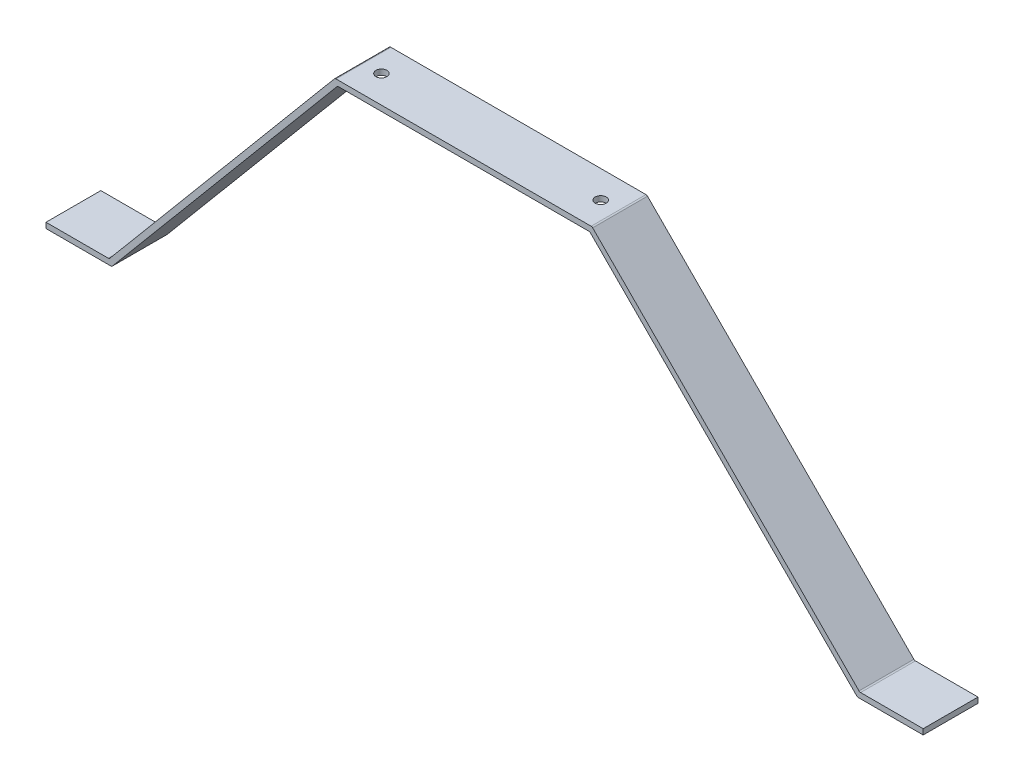
ISO-10303-21;
HEADER;
FILE_DESCRIPTION(('STEP AP214'),'2;1');
FILE_NAME('part.step','',(''),(''),'','','');
FILE_SCHEMA(('AUTOMOTIVE_DESIGN { 1 0 10303 214 1 1 1 1 }'));
ENDSEC;
DATA;
#1=APPLICATION_CONTEXT('core data for automotive mechanical design processes');
#2=APPLICATION_PROTOCOL_DEFINITION('international standard','automotive_design',2000,#1);
#3=PRODUCT_CONTEXT('',#1,'mechanical');
#4=PRODUCT('Part','Part','',(#3));
#5=PRODUCT_RELATED_PRODUCT_CATEGORY('part','',(#4));
#6=PRODUCT_DEFINITION_FORMATION('','',#4);
#7=PRODUCT_DEFINITION_CONTEXT('part definition',#1,'design');
#8=PRODUCT_DEFINITION('design','',#6,#7);
#9=PRODUCT_DEFINITION_SHAPE('','',#8);
#10=(LENGTH_UNIT() NAMED_UNIT(*) SI_UNIT(.MILLI.,.METRE.));
#11=(NAMED_UNIT(*) PLANE_ANGLE_UNIT() SI_UNIT($,.RADIAN.));
#12=(NAMED_UNIT(*) SI_UNIT($,.STERADIAN.) SOLID_ANGLE_UNIT());
#13=UNCERTAINTY_MEASURE_WITH_UNIT(LENGTH_MEASURE(1.E-05),#10,'distance_accuracy_value','');
#14=(GEOMETRIC_REPRESENTATION_CONTEXT(3) GLOBAL_UNCERTAINTY_ASSIGNED_CONTEXT((#13)) GLOBAL_UNIT_ASSIGNED_CONTEXT((#10,
#11,#12)) REPRESENTATION_CONTEXT('',''));
#15=CARTESIAN_POINT('',(0.,0.,0.));
#16=DIRECTION('',(0.,0.,1.));
#17=DIRECTION('',(1.,0.,0.));
#18=AXIS2_PLACEMENT_3D('',#15,#16,#17);
#19=CARTESIAN_POINT('',(0.,5.,50.));
#20=DIRECTION('',(1.,0.,0.));
#21=DIRECTION('',(0.,0.,-1.));
#22=AXIS2_PLACEMENT_3D('',#19,#20,#21);
#23=PLANE('',#22);
#24=DIRECTION('',(0.,-1.,0.));
#25=VECTOR('',#24,1.);
#26=CARTESIAN_POINT('',(0.,5.,0.));
#27=LINE('',#26,#25);
#28=CARTESIAN_POINT('',(0.,5.,0.));
#29=VERTEX_POINT('',#28);
#30=CARTESIAN_POINT('',(0.,0.,0.));
#31=VERTEX_POINT('',#30);
#32=EDGE_CURVE('E193',#29,#31,#27,.T.);
#33=ORIENTED_EDGE('',*,*,#32,.T.);
#34=DIRECTION('',(0.,0.,-1.));
#35=VECTOR('',#34,1.);
#36=CARTESIAN_POINT('',(0.,0.,50.));
#37=LINE('',#36,#35);
#38=CARTESIAN_POINT('',(0.,0.,50.));
#39=VERTEX_POINT('',#38);
#40=EDGE_CURVE('E175',#39,#31,#37,.T.);
#41=ORIENTED_EDGE('',*,*,#40,.F.);
#42=DIRECTION('',(0.,-1.,0.));
#43=VECTOR('',#42,1.);
#44=CARTESIAN_POINT('',(0.,5.,50.));
#45=LINE('',#44,#43);
#46=CARTESIAN_POINT('',(0.,5.,50.));
#47=VERTEX_POINT('',#46);
#48=EDGE_CURVE('E181',#47,#39,#45,.T.);
#49=ORIENTED_EDGE('',*,*,#48,.F.);
#50=DIRECTION('',(0.,0.,-1.));
#51=VECTOR('',#50,1.);
#52=CARTESIAN_POINT('',(0.,5.,50.));
#53=LINE('',#52,#51);
#54=EDGE_CURVE('E305',#47,#29,#53,.T.);
#55=ORIENTED_EDGE('',*,*,#54,.T.);
#56=EDGE_LOOP('',(#33,#41,#49,#55));
#57=FACE_BOUND('',#56,.T.);
#58=ADVANCED_FACE('F32',(#57),#23,.F.);
#59=CARTESIAN_POINT('',(0.,0.,50.));
#60=DIRECTION('',(0.,1.,0.));
#61=DIRECTION('',(0.,0.,1.));
#62=AXIS2_PLACEMENT_3D('',#59,#60,#61);
#63=PLANE('',#62);
#64=DIRECTION('',(1.,0.,0.));
#65=VECTOR('',#64,1.);
#66=CARTESIAN_POINT('',(0.,0.,0.));
#67=LINE('',#66,#65);
#68=CARTESIAN_POINT('',(59.0672769655389,0.,0.));
#69=VERTEX_POINT('',#68);
#70=EDGE_CURVE('E307',#31,#69,#67,.T.);
#71=ORIENTED_EDGE('',*,*,#70,.T.);
#72=DIRECTION('',(0.,0.,-1.));
#73=VECTOR('',#72,1.);
#74=CARTESIAN_POINT('',(59.0672769655389,0.,50.));
#75=LINE('',#74,#73);
#76=CARTESIAN_POINT('',(59.0672769655389,0.,50.));
#77=VERTEX_POINT('',#76);
#78=EDGE_CURVE('E178',#69,#77,#75,.F.);
#79=ORIENTED_EDGE('',*,*,#78,.T.);
#80=DIRECTION('',(1.,0.,0.));
#81=VECTOR('',#80,1.);
#82=CARTESIAN_POINT('',(0.,0.,50.));
#83=LINE('',#82,#81);
#84=EDGE_CURVE('E170',#39,#77,#83,.T.);
#85=ORIENTED_EDGE('',*,*,#84,.F.);
#86=ORIENTED_EDGE('',*,*,#40,.T.);
#87=EDGE_LOOP('',(#71,#79,#85,#86));
#88=FACE_BOUND('',#87,.T.);
#89=ADVANCED_FACE('F173',(#88),#63,.F.);
#90=CARTESIAN_POINT('',(265.92,245.45,50.));
#91=DIRECTION('',(-0.766101312166316,0.642719829705797,0.));
#92=DIRECTION('',(-0.642719829705797,-0.766101312166316,0.));
#93=AXIS2_PLACEMENT_3D('',#90,#91,#92);
#94=PLANE('',#93);
#95=DIRECTION('',(0.642719829705797,0.766101312166316,0.));
#96=VECTOR('',#95,1.);
#97=CARTESIAN_POINT('',(265.92,245.45,50.));
#98=LINE('',#97,#96);
#99=CARTESIAN_POINT('',(60.5994795898716,0.714560340588505,50.));
#100=VERTEX_POINT('',#99);
#101=CARTESIAN_POINT('',(265.320520410128,244.735439659412,50.));
#102=VERTEX_POINT('',#101);
#103=EDGE_CURVE('E180',#100,#102,#98,.T.);
#104=ORIENTED_EDGE('',*,*,#103,.F.);
#105=DIRECTION('',(0.,0.,-1.));
#106=VECTOR('',#105,1.);
#107=CARTESIAN_POINT('',(60.5994795898715,0.714560340588394,50.));
#108=LINE('',#107,#106);
#109=CARTESIAN_POINT('',(60.5994795898716,0.714560340588505,0.));
#110=VERTEX_POINT('',#109);
#111=EDGE_CURVE('E211',#100,#110,#108,.T.);
#112=ORIENTED_EDGE('',*,*,#111,.T.);
#113=DIRECTION('',(0.642719829705797,0.766101312166316,0.));
#114=VECTOR('',#113,1.);
#115=CARTESIAN_POINT('',(265.92,245.45,0.));
#116=LINE('',#115,#114);
#117=CARTESIAN_POINT('',(265.320520410128,244.735439659412,0.));
#118=VERTEX_POINT('',#117);
#119=EDGE_CURVE('E310',#110,#118,#116,.T.);
#120=ORIENTED_EDGE('',*,*,#119,.T.);
#121=DIRECTION('',(0.,0.,-1.));
#122=VECTOR('',#121,1.);
#123=CARTESIAN_POINT('',(265.320520410128,244.735439659412,50.));
#124=LINE('',#123,#122);
#125=EDGE_CURVE('E209',#118,#102,#124,.F.);
#126=ORIENTED_EDGE('',*,*,#125,.T.);
#127=EDGE_LOOP('',(#104,#112,#120,#126));
#128=FACE_BOUND('',#127,.T.);
#129=ADVANCED_FACE('F338',(#128),#94,.F.);
#130=CARTESIAN_POINT('',(265.92,245.45,50.));
#131=DIRECTION('',(0.,1.,0.));
#132=DIRECTION('',(0.,0.,1.));
#133=AXIS2_PLACEMENT_3D('',#130,#131,#132);
#134=PLANE('',#133);
#135=CARTESIAN_POINT('',(280.919525398347,245.45,24.9999998959961));
#136=DIRECTION('',(0.,1.,0.));
#137=DIRECTION('',(0.,0.,1.));
#138=AXIS2_PLACEMENT_3D('',#135,#136,#137);
#139=CIRCLE('',#138,4.99999999999999);
#140=CARTESIAN_POINT('',(280.919525398347,245.45,29.9999998959961));
#141=VERTEX_POINT('',#140);
#142=EDGE_CURVE('E569',#141,#141,#139,.F.);
#143=ORIENTED_EDGE('',*,*,#142,.F.);
#144=EDGE_LOOP('',(#143));
#145=FACE_BOUND('',#144,.T.);
#146=CARTESIAN_POINT('',(480.919525398347,245.45,24.9999998959962));
#147=DIRECTION('',(0.,1.,0.));
#148=DIRECTION('',(0.,0.,1.));
#149=AXIS2_PLACEMENT_3D('',#146,#147,#148);
#150=CIRCLE('',#149,4.99999999999999);
#151=CARTESIAN_POINT('',(480.919525398347,245.45,29.9999998959962));
#152=VERTEX_POINT('',#151);
#153=EDGE_CURVE('E308',#152,#152,#150,.F.);
#154=ORIENTED_EDGE('',*,*,#153,.F.);
#155=EDGE_LOOP('',(#154));
#156=FACE_BOUND('',#155,.T.);
#157=DIRECTION('',(1.,0.,0.));
#158=VECTOR('',#157,1.);
#159=CARTESIAN_POINT('',(265.92,245.45,50.));
#160=LINE('',#159,#158);
#161=CARTESIAN_POINT('',(266.852723034461,245.45,50.));
#162=VERTEX_POINT('',#161);
#163=CARTESIAN_POINT('',(495.088292213114,245.45,50.));
#164=VERTEX_POINT('',#163);
#165=EDGE_CURVE('E340',#162,#164,#160,.T.);
#166=ORIENTED_EDGE('',*,*,#165,.F.);
#167=DIRECTION('',(0.,0.,-1.));
#168=VECTOR('',#167,1.);
#169=CARTESIAN_POINT('',(266.852723034461,245.45,0.));
#170=LINE('',#169,#168);
#171=CARTESIAN_POINT('',(266.852723034461,245.45,0.));
#172=VERTEX_POINT('',#171);
#173=EDGE_CURVE('E232',#162,#172,#170,.T.);
#174=ORIENTED_EDGE('',*,*,#173,.T.);
#175=DIRECTION('',(1.,0.,0.));
#176=VECTOR('',#175,1.);
#177=CARTESIAN_POINT('',(265.92,245.45,0.));
#178=LINE('',#177,#176);
#179=CARTESIAN_POINT('',(495.088292213114,245.45,0.));
#180=VERTEX_POINT('',#179);
#181=EDGE_CURVE('E313',#172,#180,#178,.T.);
#182=ORIENTED_EDGE('',*,*,#181,.T.);
#183=DIRECTION('',(0.,0.,-1.));
#184=VECTOR('',#183,1.);
#185=CARTESIAN_POINT('',(495.088292213114,245.45,50.));
#186=LINE('',#185,#184);
#187=EDGE_CURVE('E230',#180,#164,#186,.F.);
#188=ORIENTED_EDGE('',*,*,#187,.T.);
#189=EDGE_LOOP('',(#166,#174,#182,#188));
#190=FACE_BOUND('',#189,.T.);
#191=ADVANCED_FACE('F374',(#145,#156,#190),#134,.F.);
#192=CARTESIAN_POINT('',(495.92,245.45,50.));
#193=DIRECTION('',(0.709082915336722,0.705125108883222,0.));
#194=DIRECTION('',(-0.705125108883222,0.709082915336722,0.));
#195=AXIS2_PLACEMENT_3D('',#192,#193,#194);
#196=PLANE('',#195);
#197=DIRECTION('',(0.705125108883222,-0.709082915336721,0.));
#198=VECTOR('',#197,1.);
#199=CARTESIAN_POINT('',(495.92,245.45,50.));
#200=LINE('',#199,#198);
#201=CARTESIAN_POINT('',(496.506458043787,244.860250217766,50.));
#202=VERTEX_POINT('',#201);
#203=CARTESIAN_POINT('',(739.413541956213,0.589749782233501,50.));
#204=VERTEX_POINT('',#203);
#205=EDGE_CURVE('E343',#202,#204,#200,.T.);
#206=ORIENTED_EDGE('',*,*,#205,.F.);
#207=DIRECTION('',(0.,0.,-1.));
#208=VECTOR('',#207,1.);
#209=CARTESIAN_POINT('',(496.506458043787,244.860250217766,0.));
#210=LINE('',#209,#208);
#211=CARTESIAN_POINT('',(496.506458043787,244.860250217766,0.));
#212=VERTEX_POINT('',#211);
#213=EDGE_CURVE('E241',#202,#212,#210,.T.);
#214=ORIENTED_EDGE('',*,*,#213,.T.);
#215=DIRECTION('',(0.705125108883222,-0.709082915336721,0.));
#216=VECTOR('',#215,1.);
#217=CARTESIAN_POINT('',(495.92,245.45,0.));
#218=LINE('',#217,#216);
#219=CARTESIAN_POINT('',(739.413541956213,0.589749782233501,0.));
#220=VERTEX_POINT('',#219);
#221=EDGE_CURVE('E316',#212,#220,#218,.T.);
#222=ORIENTED_EDGE('',*,*,#221,.T.);
#223=DIRECTION('',(0.,0.,-1.));
#224=VECTOR('',#223,1.);
#225=CARTESIAN_POINT('',(739.413541956213,0.589749782233501,50.));
#226=LINE('',#225,#224);
#227=EDGE_CURVE('E239',#220,#204,#226,.F.);
#228=ORIENTED_EDGE('',*,*,#227,.T.);
#229=EDGE_LOOP('',(#206,#214,#222,#228));
#230=FACE_BOUND('',#229,.T.);
#231=ADVANCED_FACE('F365',(#230),#196,.F.);
#232=CARTESIAN_POINT('',(740.,0.,50.));
#233=DIRECTION('',(0.,1.,0.));
#234=DIRECTION('',(0.,0.,1.));
#235=AXIS2_PLACEMENT_3D('',#232,#233,#234);
#236=PLANE('',#235);
#237=DIRECTION('',(1.,0.,0.));
#238=VECTOR('',#237,1.);
#239=CARTESIAN_POINT('',(740.,0.,50.));
#240=LINE('',#239,#238);
#241=CARTESIAN_POINT('',(740.831707786886,0.,50.));
#242=VERTEX_POINT('',#241);
#243=CARTESIAN_POINT('',(800.,0.,50.));
#244=VERTEX_POINT('',#243);
#245=EDGE_CURVE('E348',#242,#244,#240,.T.);
#246=ORIENTED_EDGE('',*,*,#245,.F.);
#247=DIRECTION('',(0.,0.,-1.));
#248=VECTOR('',#247,1.);
#249=CARTESIAN_POINT('',(740.831707786886,0.,50.));
#250=LINE('',#249,#248);
#251=CARTESIAN_POINT('',(740.831707786886,0.,0.));
#252=VERTEX_POINT('',#251);
#253=EDGE_CURVE('E244',#242,#252,#250,.T.);
#254=ORIENTED_EDGE('',*,*,#253,.T.);
#255=DIRECTION('',(1.,0.,0.));
#256=VECTOR('',#255,1.);
#257=CARTESIAN_POINT('',(740.,0.,0.));
#258=LINE('',#257,#256);
#259=CARTESIAN_POINT('',(800.,0.,0.));
#260=VERTEX_POINT('',#259);
#261=EDGE_CURVE('E319',#252,#260,#258,.T.);
#262=ORIENTED_EDGE('',*,*,#261,.T.);
#263=DIRECTION('',(0.,0.,-1.));
#264=VECTOR('',#263,1.);
#265=CARTESIAN_POINT('',(800.,0.,50.));
#266=LINE('',#265,#264);
#267=EDGE_CURVE('E195',#244,#260,#266,.T.);
#268=ORIENTED_EDGE('',*,*,#267,.F.);
#269=EDGE_LOOP('',(#246,#254,#262,#268));
#270=FACE_BOUND('',#269,.T.);
#271=ADVANCED_FACE('F357',(#270),#236,.F.);
#272=CARTESIAN_POINT('',(800.,5.,50.));
#273=DIRECTION('',(-1.,0.,0.));
#274=DIRECTION('',(0.,0.,1.));
#275=AXIS2_PLACEMENT_3D('',#272,#273,#274);
#276=PLANE('',#275);
#277=DIRECTION('',(0.,1.,0.));
#278=VECTOR('',#277,1.);
#279=CARTESIAN_POINT('',(800.,5.,0.));
#280=LINE('',#279,#278);
#281=CARTESIAN_POINT('',(800.,5.,0.));
#282=VERTEX_POINT('',#281);
#283=EDGE_CURVE('E284',#260,#282,#280,.T.);
#284=ORIENTED_EDGE('',*,*,#283,.T.);
#285=DIRECTION('',(0.,0.,-1.));
#286=VECTOR('',#285,1.);
#287=CARTESIAN_POINT('',(800.,5.,50.));
#288=LINE('',#287,#286);
#289=CARTESIAN_POINT('',(800.,5.,50.));
#290=VERTEX_POINT('',#289);
#291=EDGE_CURVE('E201',#290,#282,#288,.T.);
#292=ORIENTED_EDGE('',*,*,#291,.F.);
#293=DIRECTION('',(0.,1.,0.));
#294=VECTOR('',#293,1.);
#295=CARTESIAN_POINT('',(800.,5.,50.));
#296=LINE('',#295,#294);
#297=EDGE_CURVE('E298',#244,#290,#296,.T.);
#298=ORIENTED_EDGE('',*,*,#297,.F.);
#299=ORIENTED_EDGE('',*,*,#267,.T.);
#300=EDGE_LOOP('',(#284,#292,#298,#299));
#301=FACE_BOUND('',#300,.T.);
#302=ADVANCED_FACE('F353',(#301),#276,.F.);
#303=CARTESIAN_POINT('',(742.079269467216,5.,50.));
#304=DIRECTION('',(0.,-1.,0.));
#305=DIRECTION('',(0.,0.,-1.));
#306=AXIS2_PLACEMENT_3D('',#303,#304,#305);
#307=PLANE('',#306);
#308=DIRECTION('',(-1.,0.,0.));
#309=VECTOR('',#308,1.);
#310=CARTESIAN_POINT('',(742.079269467216,5.,0.));
#311=LINE('',#310,#309);
#312=CARTESIAN_POINT('',(742.910977254102,5.,0.));
#313=VERTEX_POINT('',#312);
#314=EDGE_CURVE('E272',#282,#313,#311,.T.);
#315=ORIENTED_EDGE('',*,*,#314,.T.);
#316=DIRECTION('',(0.,0.,-1.));
#317=VECTOR('',#316,1.);
#318=CARTESIAN_POINT('',(742.910977254102,5.,50.));
#319=LINE('',#318,#317);
#320=CARTESIAN_POINT('',(742.910977254102,5.,50.));
#321=VERTEX_POINT('',#320);
#322=EDGE_CURVE('E252',#313,#321,#319,.F.);
#323=ORIENTED_EDGE('',*,*,#322,.T.);
#324=DIRECTION('',(-1.,0.,0.));
#325=VECTOR('',#324,1.);
#326=CARTESIAN_POINT('',(742.079269467216,5.,50.));
#327=LINE('',#326,#325);
#328=EDGE_CURVE('E290',#290,#321,#327,.T.);
#329=ORIENTED_EDGE('',*,*,#328,.F.);
#330=ORIENTED_EDGE('',*,*,#291,.T.);
#331=EDGE_LOOP('',(#315,#323,#329,#330));
#332=FACE_BOUND('',#331,.T.);
#333=ADVANCED_FACE('F280',(#332),#307,.F.);
#334=CARTESIAN_POINT('',(497.999269467216,250.45,50.));
#335=DIRECTION('',(-0.709082915336722,-0.705125108883222,0.));
#336=DIRECTION('',(0.705125108883222,-0.709082915336722,0.));
#337=AXIS2_PLACEMENT_3D('',#334,#335,#336);
#338=PLANE('',#337);
#339=DIRECTION('',(-0.705125108883222,0.709082915336721,0.));
#340=VECTOR('',#339,1.);
#341=CARTESIAN_POINT('',(497.999269467216,250.45,50.));
#342=LINE('',#341,#340);
#343=CARTESIAN_POINT('',(741.492811423429,5.5897497822335,50.));
#344=VERTEX_POINT('',#343);
#345=CARTESIAN_POINT('',(498.585727511003,249.860250217766,50.));
#346=VERTEX_POINT('',#345);
#347=EDGE_CURVE('E289',#344,#346,#342,.T.);
#348=ORIENTED_EDGE('',*,*,#347,.F.);
#349=DIRECTION('',(0.,0.,-1.));
#350=VECTOR('',#349,1.);
#351=CARTESIAN_POINT('',(741.492811423428,5.58974978223351,0.));
#352=LINE('',#351,#350);
#353=CARTESIAN_POINT('',(741.492811423429,5.5897497822335,0.));
#354=VERTEX_POINT('',#353);
#355=EDGE_CURVE('E249',#344,#354,#352,.T.);
#356=ORIENTED_EDGE('',*,*,#355,.T.);
#357=DIRECTION('',(-0.705125108883222,0.709082915336721,0.));
#358=VECTOR('',#357,1.);
#359=CARTESIAN_POINT('',(497.999269467216,250.45,0.));
#360=LINE('',#359,#358);
#361=CARTESIAN_POINT('',(498.585727511003,249.860250217766,0.));
#362=VERTEX_POINT('',#361);
#363=EDGE_CURVE('E274',#354,#362,#360,.T.);
#364=ORIENTED_EDGE('',*,*,#363,.T.);
#365=DIRECTION('',(0.,0.,-1.));
#366=VECTOR('',#365,1.);
#367=CARTESIAN_POINT('',(498.585727511003,249.860250217766,50.));
#368=LINE('',#367,#366);
#369=EDGE_CURVE('E247',#362,#346,#368,.F.);
#370=ORIENTED_EDGE('',*,*,#369,.T.);
#371=EDGE_LOOP('',(#348,#356,#364,#370));
#372=FACE_BOUND('',#371,.T.);
#373=ADVANCED_FACE('F292',(#372),#338,.F.);
#374=CARTESIAN_POINT('',(263.588192413847,250.45,50.));
#375=DIRECTION('',(0.,-1.,0.));
#376=DIRECTION('',(0.,0.,-1.));
#377=AXIS2_PLACEMENT_3D('',#374,#375,#376);
#378=PLANE('',#377);
#379=CARTESIAN_POINT('',(280.919525398347,250.45,24.9999998959961));
#380=DIRECTION('',(0.,1.,0.));
#381=DIRECTION('',(0.,0.,1.));
#382=AXIS2_PLACEMENT_3D('',#379,#380,#381);
#383=CIRCLE('',#382,4.99999999999999);
#384=CARTESIAN_POINT('',(280.919525398347,250.45,29.9999998959961));
#385=VERTEX_POINT('',#384);
#386=EDGE_CURVE('E566',#385,#385,#383,.T.);
#387=ORIENTED_EDGE('',*,*,#386,.F.);
#388=EDGE_LOOP('',(#387));
#389=FACE_BOUND('',#388,.T.);
#390=CARTESIAN_POINT('',(480.919525398347,250.45,24.9999998959962));
#391=DIRECTION('',(0.,1.,0.));
#392=DIRECTION('',(0.,0.,1.));
#393=AXIS2_PLACEMENT_3D('',#390,#391,#392);
#394=CIRCLE('',#393,4.99999999999999);
#395=CARTESIAN_POINT('',(480.919525398347,250.45,29.9999998959962));
#396=VERTEX_POINT('',#395);
#397=EDGE_CURVE('E570',#396,#396,#394,.T.);
#398=ORIENTED_EDGE('',*,*,#397,.F.);
#399=EDGE_LOOP('',(#398));
#400=FACE_BOUND('',#399,.T.);
#401=DIRECTION('',(-1.,0.,0.));
#402=VECTOR('',#401,1.);
#403=CARTESIAN_POINT('',(263.588192413847,250.45,0.));
#404=LINE('',#403,#402);
#405=CARTESIAN_POINT('',(497.167561680329,250.45,0.));
#406=VERTEX_POINT('',#405);
#407=CARTESIAN_POINT('',(264.520915448308,250.45,0.));
#408=VERTEX_POINT('',#407);
#409=EDGE_CURVE('E323',#406,#408,#404,.T.);
#410=ORIENTED_EDGE('',*,*,#409,.T.);
#411=DIRECTION('',(0.,0.,-1.));
#412=VECTOR('',#411,1.);
#413=CARTESIAN_POINT('',(264.520915448308,250.45,50.));
#414=LINE('',#413,#412);
#415=CARTESIAN_POINT('',(264.520915448308,250.45,50.));
#416=VERTEX_POINT('',#415);
#417=EDGE_CURVE('E47',#408,#416,#414,.F.);
#418=ORIENTED_EDGE('',*,*,#417,.T.);
#419=DIRECTION('',(-1.,0.,0.));
#420=VECTOR('',#419,1.);
#421=CARTESIAN_POINT('',(263.588192413847,250.45,50.));
#422=LINE('',#421,#420);
#423=CARTESIAN_POINT('',(497.167561680329,250.45,50.));
#424=VERTEX_POINT('',#423);
#425=EDGE_CURVE('E294',#424,#416,#422,.T.);
#426=ORIENTED_EDGE('',*,*,#425,.F.);
#427=DIRECTION('',(0.,0.,-1.));
#428=VECTOR('',#427,1.);
#429=CARTESIAN_POINT('',(497.167561680329,250.45,50.));
#430=LINE('',#429,#428);
#431=EDGE_CURVE('E235',#424,#406,#430,.T.);
#432=ORIENTED_EDGE('',*,*,#431,.T.);
#433=EDGE_LOOP('',(#410,#418,#426,#432));
#434=FACE_BOUND('',#433,.T.);
#435=ADVANCED_FACE('F416',(#389,#400,#434),#378,.F.);
#436=CARTESIAN_POINT('',(263.588192413847,250.45,50.));
#437=DIRECTION('',(0.766101312166316,-0.642719829705797,0.));
#438=DIRECTION('',(0.642719829705797,0.766101312166316,0.));
#439=AXIS2_PLACEMENT_3D('',#436,#437,#438);
#440=PLANE('',#439);
#441=DIRECTION('',(-0.642719829705797,-0.766101312166316,0.));
#442=VECTOR('',#441,1.);
#443=CARTESIAN_POINT('',(263.588192413847,250.45,0.));
#444=LINE('',#443,#442);
#445=CARTESIAN_POINT('',(262.988712823976,249.735439659412,0.));
#446=VERTEX_POINT('',#445);
#447=CARTESIAN_POINT('',(58.2676720037189,5.71456034058848,0.));
#448=VERTEX_POINT('',#447);
#449=EDGE_CURVE('E325',#446,#448,#444,.T.);
#450=ORIENTED_EDGE('',*,*,#449,.T.);
#451=DIRECTION('',(0.,0.,-1.));
#452=VECTOR('',#451,1.);
#453=CARTESIAN_POINT('',(58.2676720037188,5.71456034058841,50.));
#454=LINE('',#453,#452);
#455=CARTESIAN_POINT('',(58.2676720037189,5.71456034058848,50.));
#456=VERTEX_POINT('',#455);
#457=EDGE_CURVE('E207',#448,#456,#454,.F.);
#458=ORIENTED_EDGE('',*,*,#457,.T.);
#459=DIRECTION('',(-0.642719829705797,-0.766101312166316,0.));
#460=VECTOR('',#459,1.);
#461=CARTESIAN_POINT('',(263.588192413847,250.45,50.));
#462=LINE('',#461,#460);
#463=CARTESIAN_POINT('',(262.988712823976,249.735439659412,50.));
#464=VERTEX_POINT('',#463);
#465=EDGE_CURVE('E296',#464,#456,#462,.T.);
#466=ORIENTED_EDGE('',*,*,#465,.F.);
#467=DIRECTION('',(0.,0.,-1.));
#468=VECTOR('',#467,1.);
#469=CARTESIAN_POINT('',(262.988712823976,249.735439659412,50.));
#470=LINE('',#469,#468);
#471=EDGE_CURVE('E198',#464,#446,#470,.T.);
#472=ORIENTED_EDGE('',*,*,#471,.T.);
#473=EDGE_LOOP('',(#450,#458,#466,#472));
#474=FACE_BOUND('',#473,.T.);
#475=ADVANCED_FACE('F409',(#474),#440,.F.);
#476=CARTESIAN_POINT('',(0.,5.,50.));
#477=DIRECTION('',(0.,-1.,0.));
#478=DIRECTION('',(1.,0.,0.));
#479=AXIS2_PLACEMENT_3D('',#476,#477,#478);
#480=PLANE('',#479);
#481=DIRECTION('',(-1.,0.,0.));
#482=VECTOR('',#481,1.);
#483=CARTESIAN_POINT('',(0.,5.,50.));
#484=LINE('',#483,#482);
#485=CARTESIAN_POINT('',(56.7354693793862,5.,50.));
#486=VERTEX_POINT('',#485);
#487=EDGE_CURVE('E186',#486,#47,#484,.T.);
#488=ORIENTED_EDGE('',*,*,#487,.F.);
#489=DIRECTION('',(0.,0.,-1.));
#490=VECTOR('',#489,1.);
#491=CARTESIAN_POINT('',(56.7354693793862,5.,0.));
#492=LINE('',#491,#490);
#493=CARTESIAN_POINT('',(56.7354693793862,5.,0.));
#494=VERTEX_POINT('',#493);
#495=EDGE_CURVE('E194',#486,#494,#492,.T.);
#496=ORIENTED_EDGE('',*,*,#495,.T.);
#497=DIRECTION('',(-1.,0.,0.));
#498=VECTOR('',#497,1.);
#499=CARTESIAN_POINT('',(0.,5.,0.));
#500=LINE('',#499,#498);
#501=EDGE_CURVE('E190',#494,#29,#500,.T.);
#502=ORIENTED_EDGE('',*,*,#501,.T.);
#503=ORIENTED_EDGE('',*,*,#54,.F.);
#504=EDGE_LOOP('',(#488,#496,#502,#503));
#505=FACE_BOUND('',#504,.T.);
#506=ADVANCED_FACE('F407',(#505),#480,.F.);
#507=CARTESIAN_POINT('',(0.,0.,50.));
#508=DIRECTION('',(0.,0.,1.));
#509=DIRECTION('',(1.,0.,0.));
#510=AXIS2_PLACEMENT_3D('',#507,#508,#509);
#511=PLANE('',#510);
#512=ORIENTED_EDGE('',*,*,#84,.T.);
#513=CARTESIAN_POINT('',(59.0672769655389,2.,50.));
#514=DIRECTION('',(0.,0.,1.));
#515=DIRECTION('',(1.,0.,0.));
#516=AXIS2_PLACEMENT_3D('',#513,#514,#515);
#517=CIRCLE('',#516,2.);
#518=EDGE_CURVE('E228',#77,#100,#517,.T.);
#519=ORIENTED_EDGE('',*,*,#518,.T.);
#520=ORIENTED_EDGE('',*,*,#103,.T.);
#521=CARTESIAN_POINT('',(266.852723034461,243.45,50.));
#522=DIRECTION('',(0.,0.,1.));
#523=DIRECTION('',(1.,0.,0.));
#524=AXIS2_PLACEMENT_3D('',#521,#522,#523);
#525=CIRCLE('',#524,2.);
#526=EDGE_CURVE('E260',#102,#162,#525,.F.);
#527=ORIENTED_EDGE('',*,*,#526,.T.);
#528=ORIENTED_EDGE('',*,*,#165,.T.);
#529=CARTESIAN_POINT('',(495.088292213114,243.45,50.));
#530=DIRECTION('',(0.,0.,1.));
#531=DIRECTION('',(1.,0.,0.));
#532=AXIS2_PLACEMENT_3D('',#529,#530,#531);
#533=CIRCLE('',#532,2.);
#534=EDGE_CURVE('E264',#164,#202,#533,.F.);
#535=ORIENTED_EDGE('',*,*,#534,.T.);
#536=ORIENTED_EDGE('',*,*,#205,.T.);
#537=CARTESIAN_POINT('',(740.831707786886,2.,50.));
#538=DIRECTION('',(0.,0.,1.));
#539=DIRECTION('',(1.,0.,0.));
#540=AXIS2_PLACEMENT_3D('',#537,#538,#539);
#541=CIRCLE('',#540,2.);
#542=EDGE_CURVE('E224',#204,#242,#541,.T.);
#543=ORIENTED_EDGE('',*,*,#542,.T.);
#544=ORIENTED_EDGE('',*,*,#245,.T.);
#545=ORIENTED_EDGE('',*,*,#297,.T.);
#546=ORIENTED_EDGE('',*,*,#328,.T.);
#547=CARTESIAN_POINT('',(742.910977254102,6.99999999999998,50.));
#548=DIRECTION('',(0.,0.,1.));
#549=DIRECTION('',(1.,0.,0.));
#550=AXIS2_PLACEMENT_3D('',#547,#548,#549);
#551=CIRCLE('',#550,2.);
#552=EDGE_CURVE('E11',#321,#344,#551,.F.);
#553=ORIENTED_EDGE('',*,*,#552,.T.);
#554=ORIENTED_EDGE('',*,*,#347,.T.);
#555=CARTESIAN_POINT('',(497.167561680329,248.45,50.));
#556=DIRECTION('',(0.,0.,1.));
#557=DIRECTION('',(1.,0.,0.));
#558=AXIS2_PLACEMENT_3D('',#555,#556,#557);
#559=CIRCLE('',#558,2.);
#560=EDGE_CURVE('E54',#346,#424,#559,.T.);
#561=ORIENTED_EDGE('',*,*,#560,.T.);
#562=ORIENTED_EDGE('',*,*,#425,.T.);
#563=CARTESIAN_POINT('',(264.520915448308,248.45,50.));
#564=DIRECTION('',(0.,0.,1.));
#565=DIRECTION('',(1.,0.,0.));
#566=AXIS2_PLACEMENT_3D('',#563,#564,#565);
#567=CIRCLE('',#566,2.);
#568=EDGE_CURVE('E226',#416,#464,#567,.T.);
#569=ORIENTED_EDGE('',*,*,#568,.T.);
#570=ORIENTED_EDGE('',*,*,#465,.T.);
#571=CARTESIAN_POINT('',(56.7354693793862,7.,50.));
#572=DIRECTION('',(0.,0.,1.));
#573=DIRECTION('',(1.,0.,0.));
#574=AXIS2_PLACEMENT_3D('',#571,#572,#573);
#575=CIRCLE('',#574,2.);
#576=EDGE_CURVE('E256',#456,#486,#575,.F.);
#577=ORIENTED_EDGE('',*,*,#576,.T.);
#578=ORIENTED_EDGE('',*,*,#487,.T.);
#579=ORIENTED_EDGE('',*,*,#48,.T.);
#580=EDGE_LOOP('',(#512,#519,#520,#527,#528,#535,#536,#543,#544,#545,#546,#553,#554,#561,#562,
#569,#570,#577,#578,#579));
#581=FACE_BOUND('',#580,.T.);
#582=ADVANCED_FACE('F184',(#581),#511,.T.);
#583=CARTESIAN_POINT('',(0.,0.,0.));
#584=DIRECTION('',(0.,0.,1.));
#585=DIRECTION('',(1.,0.,0.));
#586=AXIS2_PLACEMENT_3D('',#583,#584,#585);
#587=PLANE('',#586);
#588=ORIENTED_EDGE('',*,*,#119,.F.);
#589=CARTESIAN_POINT('',(59.0672769655389,2.,0.));
#590=DIRECTION('',(0.,0.,1.));
#591=DIRECTION('',(1.,0.,0.));
#592=AXIS2_PLACEMENT_3D('',#589,#590,#591);
#593=CIRCLE('',#592,2.);
#594=EDGE_CURVE('E220',#110,#69,#593,.F.);
#595=ORIENTED_EDGE('',*,*,#594,.T.);
#596=ORIENTED_EDGE('',*,*,#70,.F.);
#597=ORIENTED_EDGE('',*,*,#32,.F.);
#598=ORIENTED_EDGE('',*,*,#501,.F.);
#599=CARTESIAN_POINT('',(56.7354693793862,7.,0.));
#600=DIRECTION('',(0.,0.,1.));
#601=DIRECTION('',(1.,0.,0.));
#602=AXIS2_PLACEMENT_3D('',#599,#600,#601);
#603=CIRCLE('',#602,2.);
#604=EDGE_CURVE('E254',#494,#448,#603,.T.);
#605=ORIENTED_EDGE('',*,*,#604,.T.);
#606=ORIENTED_EDGE('',*,*,#449,.F.);
#607=CARTESIAN_POINT('',(264.520915448308,248.45,0.));
#608=DIRECTION('',(0.,0.,1.));
#609=DIRECTION('',(1.,0.,0.));
#610=AXIS2_PLACEMENT_3D('',#607,#608,#609);
#611=CIRCLE('',#610,2.);
#612=EDGE_CURVE('E218',#446,#408,#611,.F.);
#613=ORIENTED_EDGE('',*,*,#612,.T.);
#614=ORIENTED_EDGE('',*,*,#409,.F.);
#615=CARTESIAN_POINT('',(497.167561680329,248.45,0.));
#616=DIRECTION('',(0.,0.,1.));
#617=DIRECTION('',(1.,0.,0.));
#618=AXIS2_PLACEMENT_3D('',#615,#616,#617);
#619=CIRCLE('',#618,2.);
#620=EDGE_CURVE('E214',#406,#362,#619,.F.);
#621=ORIENTED_EDGE('',*,*,#620,.T.);
#622=ORIENTED_EDGE('',*,*,#363,.F.);
#623=CARTESIAN_POINT('',(742.910977254102,6.99999999999998,0.));
#624=DIRECTION('',(0.,0.,1.));
#625=DIRECTION('',(1.,0.,0.));
#626=AXIS2_PLACEMENT_3D('',#623,#624,#625);
#627=CIRCLE('',#626,2.);
#628=EDGE_CURVE('E40',#354,#313,#627,.T.);
#629=ORIENTED_EDGE('',*,*,#628,.T.);
#630=ORIENTED_EDGE('',*,*,#314,.F.);
#631=ORIENTED_EDGE('',*,*,#283,.F.);
#632=ORIENTED_EDGE('',*,*,#261,.F.);
#633=CARTESIAN_POINT('',(740.831707786886,2.,0.));
#634=DIRECTION('',(0.,0.,1.));
#635=DIRECTION('',(1.,0.,0.));
#636=AXIS2_PLACEMENT_3D('',#633,#634,#635);
#637=CIRCLE('',#636,2.);
#638=EDGE_CURVE('E216',#252,#220,#637,.F.);
#639=ORIENTED_EDGE('',*,*,#638,.T.);
#640=ORIENTED_EDGE('',*,*,#221,.F.);
#641=CARTESIAN_POINT('',(495.088292213114,243.45,0.));
#642=DIRECTION('',(0.,0.,1.));
#643=DIRECTION('',(1.,0.,0.));
#644=AXIS2_PLACEMENT_3D('',#641,#642,#643);
#645=CIRCLE('',#644,2.);
#646=EDGE_CURVE('E262',#212,#180,#645,.T.);
#647=ORIENTED_EDGE('',*,*,#646,.T.);
#648=ORIENTED_EDGE('',*,*,#181,.F.);
#649=CARTESIAN_POINT('',(266.852723034461,243.45,0.));
#650=DIRECTION('',(0.,0.,1.));
#651=DIRECTION('',(1.,0.,0.));
#652=AXIS2_PLACEMENT_3D('',#649,#650,#651);
#653=CIRCLE('',#652,2.);
#654=EDGE_CURVE('E258',#172,#118,#653,.T.);
#655=ORIENTED_EDGE('',*,*,#654,.T.);
#656=EDGE_LOOP('',(#588,#595,#596,#597,#598,#605,#606,#613,#614,#621,#622,#629,#630,#631,#632,
#639,#640,#647,#648,#655));
#657=FACE_BOUND('',#656,.T.);
#658=ADVANCED_FACE('F270',(#657),#587,.F.);
#659=CARTESIAN_POINT('',(56.7354693793862,7.,50.));
#660=DIRECTION('',(0.,0.,1.));
#661=DIRECTION('',(1.,0.,0.));
#662=AXIS2_PLACEMENT_3D('',#659,#660,#661);
#663=CYLINDRICAL_SURFACE('',#662,2.);
#664=ORIENTED_EDGE('',*,*,#576,.F.);
#665=ORIENTED_EDGE('',*,*,#457,.F.);
#666=ORIENTED_EDGE('',*,*,#604,.F.);
#667=ORIENTED_EDGE('',*,*,#495,.F.);
#668=EDGE_LOOP('',(#664,#665,#666,#667));
#669=FACE_BOUND('',#668,.T.);
#670=ADVANCED_FACE('F387',(#669),#663,.F.);
#671=CARTESIAN_POINT('',(59.0672769655389,2.,50.));
#672=DIRECTION('',(0.,0.,-1.));
#673=DIRECTION('',(-1.,0.,0.));
#674=AXIS2_PLACEMENT_3D('',#671,#672,#673);
#675=CYLINDRICAL_SURFACE('',#674,2.);
#676=ORIENTED_EDGE('',*,*,#518,.F.);
#677=ORIENTED_EDGE('',*,*,#78,.F.);
#678=ORIENTED_EDGE('',*,*,#594,.F.);
#679=ORIENTED_EDGE('',*,*,#111,.F.);
#680=EDGE_LOOP('',(#676,#677,#678,#679));
#681=FACE_BOUND('',#680,.T.);
#682=ADVANCED_FACE('F332',(#681),#675,.T.);
#683=CARTESIAN_POINT('',(266.852723034461,243.45,50.));
#684=DIRECTION('',(0.,0.,1.));
#685=DIRECTION('',(1.,0.,0.));
#686=AXIS2_PLACEMENT_3D('',#683,#684,#685);
#687=CYLINDRICAL_SURFACE('',#686,2.);
#688=ORIENTED_EDGE('',*,*,#526,.F.);
#689=ORIENTED_EDGE('',*,*,#125,.F.);
#690=ORIENTED_EDGE('',*,*,#654,.F.);
#691=ORIENTED_EDGE('',*,*,#173,.F.);
#692=EDGE_LOOP('',(#688,#689,#690,#691));
#693=FACE_BOUND('',#692,.T.);
#694=ADVANCED_FACE('F377',(#693),#687,.F.);
#695=CARTESIAN_POINT('',(264.520915448308,248.45,50.));
#696=DIRECTION('',(0.,0.,-1.));
#697=DIRECTION('',(-1.,0.,0.));
#698=AXIS2_PLACEMENT_3D('',#695,#696,#697);
#699=CYLINDRICAL_SURFACE('',#698,2.);
#700=ORIENTED_EDGE('',*,*,#568,.F.);
#701=ORIENTED_EDGE('',*,*,#417,.F.);
#702=ORIENTED_EDGE('',*,*,#612,.F.);
#703=ORIENTED_EDGE('',*,*,#471,.F.);
#704=EDGE_LOOP('',(#700,#701,#702,#703));
#705=FACE_BOUND('',#704,.T.);
#706=ADVANCED_FACE('F379',(#705),#699,.T.);
#707=CARTESIAN_POINT('',(495.088292213114,243.45,50.));
#708=DIRECTION('',(0.,0.,1.));
#709=DIRECTION('',(1.,0.,0.));
#710=AXIS2_PLACEMENT_3D('',#707,#708,#709);
#711=CYLINDRICAL_SURFACE('',#710,2.);
#712=ORIENTED_EDGE('',*,*,#534,.F.);
#713=ORIENTED_EDGE('',*,*,#187,.F.);
#714=ORIENTED_EDGE('',*,*,#646,.F.);
#715=ORIENTED_EDGE('',*,*,#213,.F.);
#716=EDGE_LOOP('',(#712,#713,#714,#715));
#717=FACE_BOUND('',#716,.T.);
#718=ADVANCED_FACE('F371',(#717),#711,.F.);
#719=CARTESIAN_POINT('',(740.831707786886,2.,50.));
#720=DIRECTION('',(0.,0.,-1.));
#721=DIRECTION('',(-1.,0.,0.));
#722=AXIS2_PLACEMENT_3D('',#719,#720,#721);
#723=CYLINDRICAL_SURFACE('',#722,2.);
#724=ORIENTED_EDGE('',*,*,#542,.F.);
#725=ORIENTED_EDGE('',*,*,#227,.F.);
#726=ORIENTED_EDGE('',*,*,#638,.F.);
#727=ORIENTED_EDGE('',*,*,#253,.F.);
#728=EDGE_LOOP('',(#724,#725,#726,#727));
#729=FACE_BOUND('',#728,.T.);
#730=ADVANCED_FACE('F361',(#729),#723,.T.);
#731=CARTESIAN_POINT('',(742.910977254102,6.99999999999998,50.));
#732=DIRECTION('',(0.,0.,1.));
#733=DIRECTION('',(1.,0.,0.));
#734=AXIS2_PLACEMENT_3D('',#731,#732,#733);
#735=CYLINDRICAL_SURFACE('',#734,2.);
#736=ORIENTED_EDGE('',*,*,#552,.F.);
#737=ORIENTED_EDGE('',*,*,#322,.F.);
#738=ORIENTED_EDGE('',*,*,#628,.F.);
#739=ORIENTED_EDGE('',*,*,#355,.F.);
#740=EDGE_LOOP('',(#736,#737,#738,#739));
#741=FACE_BOUND('',#740,.T.);
#742=ADVANCED_FACE('F287',(#741),#735,.F.);
#743=CARTESIAN_POINT('',(497.167561680329,248.45,50.));
#744=DIRECTION('',(0.,0.,-1.));
#745=DIRECTION('',(-1.,0.,0.));
#746=AXIS2_PLACEMENT_3D('',#743,#744,#745);
#747=CYLINDRICAL_SURFACE('',#746,2.);
#748=ORIENTED_EDGE('',*,*,#560,.F.);
#749=ORIENTED_EDGE('',*,*,#369,.F.);
#750=ORIENTED_EDGE('',*,*,#620,.F.);
#751=ORIENTED_EDGE('',*,*,#431,.F.);
#752=EDGE_LOOP('',(#748,#749,#750,#751));
#753=FACE_BOUND('',#752,.T.);
#754=ADVANCED_FACE('F34',(#753),#747,.T.);
#755=CARTESIAN_POINT('',(480.919525398347,-0.000999999999973245,24.9999998959962));
#756=DIRECTION('',(0.,1.,0.));
#757=DIRECTION('',(0.,0.,1.));
#758=AXIS2_PLACEMENT_3D('',#755,#756,#757);
#759=CYLINDRICAL_SURFACE('',#758,4.99999999999999);
#760=ORIENTED_EDGE('',*,*,#397,.T.);
#761=EDGE_LOOP('',(#760));
#762=FACE_BOUND('',#761,.T.);
#763=ORIENTED_EDGE('',*,*,#153,.T.);
#764=EDGE_LOOP('',(#763));
#765=FACE_BOUND('',#764,.T.);
#766=ADVANCED_FACE('F540',(#762,#765),#759,.F.);
#767=CARTESIAN_POINT('',(280.919525398347,-0.000999999999973245,24.9999998959961));
#768=DIRECTION('',(0.,1.,0.));
#769=DIRECTION('',(0.,0.,1.));
#770=AXIS2_PLACEMENT_3D('',#767,#768,#769);
#771=CYLINDRICAL_SURFACE('',#770,4.99999999999999);
#772=ORIENTED_EDGE('',*,*,#386,.T.);
#773=EDGE_LOOP('',(#772));
#774=FACE_BOUND('',#773,.T.);
#775=ORIENTED_EDGE('',*,*,#142,.T.);
#776=EDGE_LOOP('',(#775));
#777=FACE_BOUND('',#776,.T.);
#778=ADVANCED_FACE('F549',(#774,#777),#771,.F.);
#779=CLOSED_SHELL('',(#58,#89,#129,#191,#231,#271,#302,#333,#373,#435,#475,#506,#582,#658,#670,
#682,#694,#706,#718,#730,#742,#754,#766,#778));
#780=MANIFOLD_SOLID_BREP('B2',#779);
#781=ADVANCED_BREP_SHAPE_REPRESENTATION('',(#18,#780),#14);
#782=SHAPE_DEFINITION_REPRESENTATION(#9,#781);
ENDSEC;
END-ISO-10303-21;
